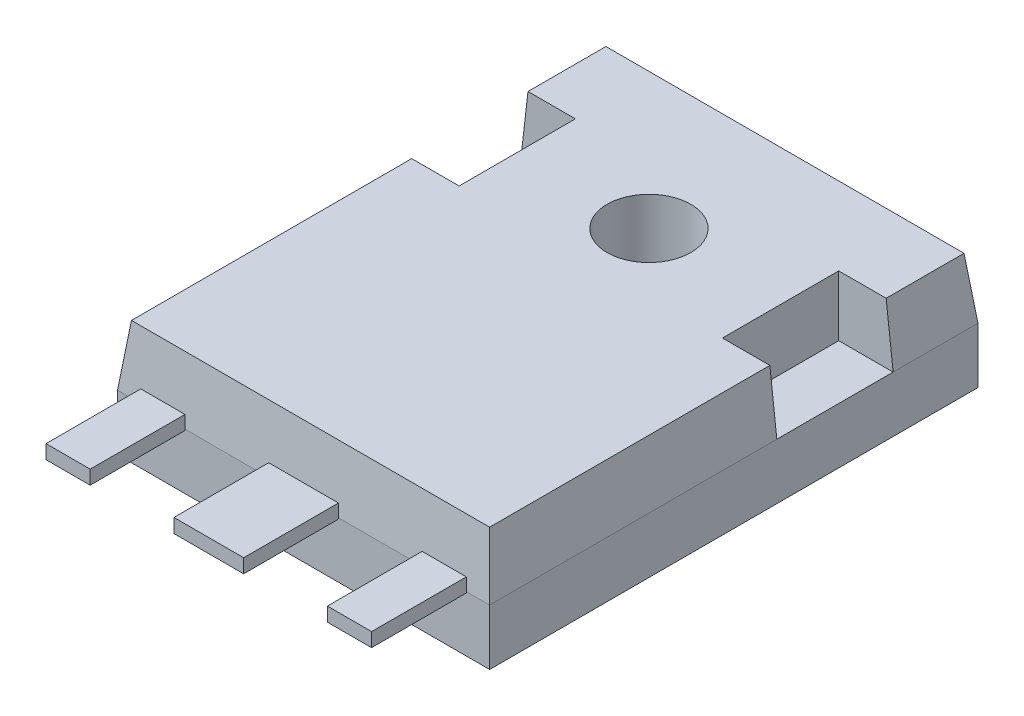
ISO-10303-21;
HEADER;
FILE_DESCRIPTION(('STEP AP214'),'2;1');
FILE_NAME('part.step','',(''),(''),'','','');
FILE_SCHEMA(('AUTOMOTIVE_DESIGN { 1 0 10303 214 1 1 1 1 }'));
ENDSEC;
DATA;
#1=APPLICATION_CONTEXT('core data for automotive mechanical design processes');
#2=APPLICATION_PROTOCOL_DEFINITION('international standard','automotive_design',2000,#1);
#3=PRODUCT_CONTEXT('',#1,'mechanical');
#4=PRODUCT('Part','Part','',(#3));
#5=PRODUCT_RELATED_PRODUCT_CATEGORY('part','',(#4));
#6=PRODUCT_DEFINITION_FORMATION('','',#4);
#7=PRODUCT_DEFINITION_CONTEXT('part definition',#1,'design');
#8=PRODUCT_DEFINITION('design','',#6,#7);
#9=PRODUCT_DEFINITION_SHAPE('','',#8);
#10=(LENGTH_UNIT() NAMED_UNIT(*) SI_UNIT(.MILLI.,.METRE.));
#11=(NAMED_UNIT(*) PLANE_ANGLE_UNIT() SI_UNIT($,.RADIAN.));
#12=(NAMED_UNIT(*) SI_UNIT($,.STERADIAN.) SOLID_ANGLE_UNIT());
#13=UNCERTAINTY_MEASURE_WITH_UNIT(LENGTH_MEASURE(1.E-05),#10,'distance_accuracy_value','');
#14=(GEOMETRIC_REPRESENTATION_CONTEXT(3) GLOBAL_UNCERTAINTY_ASSIGNED_CONTEXT((#13)) GLOBAL_UNIT_ASSIGNED_CONTEXT((#10,
#11,#12)) REPRESENTATION_CONTEXT('',''));
#15=CARTESIAN_POINT('',(0.,0.,0.));
#16=DIRECTION('',(0.,0.,1.));
#17=DIRECTION('',(1.,0.,0.));
#18=AXIS2_PLACEMENT_3D('',#15,#16,#17);
#19=CARTESIAN_POINT('',(-8.00000000000001,5.,10.5));
#20=DIRECTION('',(0.,0.,-1.));
#21=DIRECTION('',(-1.,0.,0.));
#22=AXIS2_PLACEMENT_3D('',#19,#20,#21);
#23=PLANE('',#22);
#24=DIRECTION('',(0.,1.,0.));
#25=VECTOR('',#24,1.);
#26=CARTESIAN_POINT('',(1.5,2.35,10.5));
#27=LINE('',#26,#25);
#28=CARTESIAN_POINT('',(1.5,2.35,10.5));
#29=VERTEX_POINT('',#28);
#30=CARTESIAN_POINT('',(1.5,2.39999999999993,10.5));
#31=VERTEX_POINT('',#30);
#32=EDGE_CURVE('E926',#29,#31,#27,.T.);
#33=ORIENTED_EDGE('',*,*,#32,.F.);
#34=DIRECTION('',(1.,0.,0.));
#35=VECTOR('',#34,1.);
#36=CARTESIAN_POINT('',(-1.5,2.35,10.5));
#37=LINE('',#36,#35);
#38=CARTESIAN_POINT('',(-1.5,2.35,10.5));
#39=VERTEX_POINT('',#38);
#40=EDGE_CURVE('E890',#39,#29,#37,.T.);
#41=ORIENTED_EDGE('',*,*,#40,.F.);
#42=DIRECTION('',(0.,-1.,0.));
#43=VECTOR('',#42,1.);
#44=CARTESIAN_POINT('',(-1.5,2.35,10.5));
#45=LINE('',#44,#43);
#46=CARTESIAN_POINT('',(-1.5,2.39999999999993,10.5));
#47=VERTEX_POINT('',#46);
#48=EDGE_CURVE('E885',#47,#39,#45,.T.);
#49=ORIENTED_EDGE('',*,*,#48,.F.);
#50=DIRECTION('',(-1.,0.,0.));
#51=VECTOR('',#50,1.);
#52=CARTESIAN_POINT('',(-8.00000000000001,2.39999999999993,10.5));
#53=LINE('',#52,#51);
#54=CARTESIAN_POINT('',(-5.10000000000001,2.39999999999993,10.5));
#55=VERTEX_POINT('',#54);
#56=EDGE_CURVE('E384',#47,#55,#53,.T.);
#57=ORIENTED_EDGE('',*,*,#56,.T.);
#58=DIRECTION('',(0.,1.,0.));
#59=VECTOR('',#58,1.);
#60=CARTESIAN_POINT('',(-5.10000000000001,2.35,10.5));
#61=LINE('',#60,#59);
#62=CARTESIAN_POINT('',(-5.10000000000001,2.35,10.5));
#63=VERTEX_POINT('',#62);
#64=EDGE_CURVE('E266',#63,#55,#61,.T.);
#65=ORIENTED_EDGE('',*,*,#64,.F.);
#66=DIRECTION('',(1.,0.,0.));
#67=VECTOR('',#66,1.);
#68=CARTESIAN_POINT('',(-7.00000000000001,2.35,10.5));
#69=LINE('',#68,#67);
#70=CARTESIAN_POINT('',(-7.00000000000001,2.35,10.5));
#71=VERTEX_POINT('',#70);
#72=EDGE_CURVE('E262',#71,#63,#69,.T.);
#73=ORIENTED_EDGE('',*,*,#72,.F.);
#74=DIRECTION('',(0.,-1.,0.));
#75=VECTOR('',#74,1.);
#76=CARTESIAN_POINT('',(-7.00000000000001,2.35,10.5));
#77=LINE('',#76,#75);
#78=CARTESIAN_POINT('',(-7.00000000000001,2.39999999999993,10.5));
#79=VERTEX_POINT('',#78);
#80=EDGE_CURVE('E47',#79,#71,#77,.T.);
#81=ORIENTED_EDGE('',*,*,#80,.F.);
#82=CARTESIAN_POINT('',(-8.00000000000001,2.39999999999993,10.5));
#83=VERTEX_POINT('',#82);
#84=EDGE_CURVE('E378',#79,#83,#53,.T.);
#85=ORIENTED_EDGE('',*,*,#84,.T.);
#86=DIRECTION('',(0.,-1.,0.));
#87=VECTOR('',#86,1.);
#88=CARTESIAN_POINT('',(-8.00000000000001,5.,10.5));
#89=LINE('',#88,#87);
#90=CARTESIAN_POINT('',(-8.00000000000001,0.,10.5));
#91=VERTEX_POINT('',#90);
#92=EDGE_CURVE('E352',#83,#91,#89,.T.);
#93=ORIENTED_EDGE('',*,*,#92,.T.);
#94=DIRECTION('',(1.,0.,0.));
#95=VECTOR('',#94,1.);
#96=CARTESIAN_POINT('',(-8.00000000000001,0.,10.5));
#97=LINE('',#96,#95);
#98=CARTESIAN_POINT('',(7.99999999999999,0.,10.5));
#99=VERTEX_POINT('',#98);
#100=EDGE_CURVE('E347',#91,#99,#97,.T.);
#101=ORIENTED_EDGE('',*,*,#100,.T.);
#102=DIRECTION('',(0.,-1.,0.));
#103=VECTOR('',#102,1.);
#104=CARTESIAN_POINT('',(7.99999999999999,5.,10.5));
#105=LINE('',#104,#103);
#106=CARTESIAN_POINT('',(7.99999999999999,2.39999999999993,10.5));
#107=VERTEX_POINT('',#106);
#108=EDGE_CURVE('E350',#107,#99,#105,.T.);
#109=ORIENTED_EDGE('',*,*,#108,.F.);
#110=CARTESIAN_POINT('',(7.,2.39999999999993,10.5));
#111=VERTEX_POINT('',#110);
#112=EDGE_CURVE('E379',#107,#111,#53,.T.);
#113=ORIENTED_EDGE('',*,*,#112,.T.);
#114=DIRECTION('',(0.,1.,0.));
#115=VECTOR('',#114,1.);
#116=CARTESIAN_POINT('',(7.00000000000001,2.35,10.5));
#117=LINE('',#116,#115);
#118=CARTESIAN_POINT('',(7.00000000000001,2.35,10.5));
#119=VERTEX_POINT('',#118);
#120=EDGE_CURVE('E908',#119,#111,#117,.T.);
#121=ORIENTED_EDGE('',*,*,#120,.F.);
#122=DIRECTION('',(1.,0.,0.));
#123=VECTOR('',#122,1.);
#124=CARTESIAN_POINT('',(7.00000000000001,2.35,10.5));
#125=LINE('',#124,#123);
#126=CARTESIAN_POINT('',(5.10000000000001,2.35,10.5));
#127=VERTEX_POINT('',#126);
#128=EDGE_CURVE('E905',#127,#119,#125,.T.);
#129=ORIENTED_EDGE('',*,*,#128,.F.);
#130=DIRECTION('',(0.,-1.,0.));
#131=VECTOR('',#130,1.);
#132=CARTESIAN_POINT('',(5.10000000000001,2.35,10.5));
#133=LINE('',#132,#131);
#134=CARTESIAN_POINT('',(5.10000000000001,2.39999999999993,10.5));
#135=VERTEX_POINT('',#134);
#136=EDGE_CURVE('E912',#135,#127,#133,.T.);
#137=ORIENTED_EDGE('',*,*,#136,.F.);
#138=EDGE_CURVE('E868',#135,#31,#53,.T.);
#139=ORIENTED_EDGE('',*,*,#138,.T.);
#140=EDGE_LOOP('',(#33,#41,#49,#57,#65,#73,#81,#85,#93,#101,#109,#113,#121,#129,#137,#139));
#141=FACE_BOUND('',#140,.T.);
#142=ADVANCED_FACE('F39',(#141),#23,.F.);
#143=CARTESIAN_POINT('',(7.99999999999999,5.,10.5));
#144=DIRECTION('',(-1.,0.,0.));
#145=DIRECTION('',(0.,0.,1.));
#146=AXIS2_PLACEMENT_3D('',#143,#144,#145);
#147=PLANE('',#146);
#148=DIRECTION('',(0.,0.,-1.));
#149=VECTOR('',#148,1.);
#150=CARTESIAN_POINT('',(8.00000000000001,2.4,-6.84999999999999));
#151=LINE('',#150,#149);
#152=CARTESIAN_POINT('',(8.00000000000001,2.4,-1.84999999999999));
#153=VERTEX_POINT('',#152);
#154=CARTESIAN_POINT('',(8.00000000000001,2.4,-6.84999999999999));
#155=VERTEX_POINT('',#154);
#156=EDGE_CURVE('E299',#153,#155,#151,.T.);
#157=ORIENTED_EDGE('',*,*,#156,.F.);
#158=DIRECTION('',(0.,0.,1.));
#159=VECTOR('',#158,1.);
#160=CARTESIAN_POINT('',(7.99999999999999,2.39999999999993,10.5));
#161=LINE('',#160,#159);
#162=EDGE_CURVE('E376',#153,#107,#161,.T.);
#163=ORIENTED_EDGE('',*,*,#162,.T.);
#164=ORIENTED_EDGE('',*,*,#108,.T.);
#165=DIRECTION('',(0.,0.,-1.));
#166=VECTOR('',#165,1.);
#167=CARTESIAN_POINT('',(7.99999999999999,0.,10.5));
#168=LINE('',#167,#166);
#169=CARTESIAN_POINT('',(7.99999999999999,0.,-10.5));
#170=VERTEX_POINT('',#169);
#171=EDGE_CURVE('E336',#99,#170,#168,.T.);
#172=ORIENTED_EDGE('',*,*,#171,.T.);
#173=DIRECTION('',(0.,-1.,0.));
#174=VECTOR('',#173,1.);
#175=CARTESIAN_POINT('',(7.99999999999999,5.,-10.5));
#176=LINE('',#175,#174);
#177=CARTESIAN_POINT('',(7.99999999999999,2.39999999999993,-10.5));
#178=VERTEX_POINT('',#177);
#179=EDGE_CURVE('E356',#178,#170,#176,.T.);
#180=ORIENTED_EDGE('',*,*,#179,.F.);
#181=DIRECTION('',(0.,0.,1.));
#182=VECTOR('',#181,1.);
#183=CARTESIAN_POINT('',(7.99999999999999,2.39999999999993,10.5));
#184=LINE('',#183,#182);
#185=EDGE_CURVE('E374',#178,#155,#184,.T.);
#186=ORIENTED_EDGE('',*,*,#185,.T.);
#187=EDGE_LOOP('',(#157,#163,#164,#172,#180,#186));
#188=FACE_BOUND('',#187,.T.);
#189=ADVANCED_FACE('F459',(#188),#147,.F.);
#190=CARTESIAN_POINT('',(-8.00000000000001,5.,-10.5));
#191=DIRECTION('',(0.,0.,1.));
#192=DIRECTION('',(1.,0.,0.));
#193=AXIS2_PLACEMENT_3D('',#190,#191,#192);
#194=PLANE('',#193);
#195=DIRECTION('',(0.,-1.,0.));
#196=VECTOR('',#195,1.);
#197=CARTESIAN_POINT('',(-8.00000000000001,5.,-10.5));
#198=LINE('',#197,#196);
#199=CARTESIAN_POINT('',(-8.00000000000001,2.39999999999993,-10.5));
#200=VERTEX_POINT('',#199);
#201=CARTESIAN_POINT('',(-8.00000000000001,0.,-10.5));
#202=VERTEX_POINT('',#201);
#203=EDGE_CURVE('E354',#200,#202,#198,.T.);
#204=ORIENTED_EDGE('',*,*,#203,.F.);
#205=DIRECTION('',(1.,0.,0.));
#206=VECTOR('',#205,1.);
#207=CARTESIAN_POINT('',(-8.00000000000001,2.39999999999993,-10.5));
#208=LINE('',#207,#206);
#209=EDGE_CURVE('E393',#200,#178,#208,.T.);
#210=ORIENTED_EDGE('',*,*,#209,.T.);
#211=ORIENTED_EDGE('',*,*,#179,.T.);
#212=DIRECTION('',(-1.,0.,0.));
#213=VECTOR('',#212,1.);
#214=CARTESIAN_POINT('',(-8.00000000000001,0.,-10.5));
#215=LINE('',#214,#213);
#216=EDGE_CURVE('E341',#170,#202,#215,.T.);
#217=ORIENTED_EDGE('',*,*,#216,.T.);
#218=EDGE_LOOP('',(#204,#210,#211,#217));
#219=FACE_BOUND('',#218,.T.);
#220=ADVANCED_FACE('F481',(#219),#194,.F.);
#221=CARTESIAN_POINT('',(-8.00000000000001,5.,10.5));
#222=DIRECTION('',(1.,0.,0.));
#223=DIRECTION('',(0.,0.,-1.));
#224=AXIS2_PLACEMENT_3D('',#221,#222,#223);
#225=PLANE('',#224);
#226=ORIENTED_EDGE('',*,*,#92,.F.);
#227=DIRECTION('',(0.,0.,-1.));
#228=VECTOR('',#227,1.);
#229=CARTESIAN_POINT('',(-8.00000000000001,2.39999999999993,10.5));
#230=LINE('',#229,#228);
#231=CARTESIAN_POINT('',(-8.00000000000001,2.4,-1.84999999999999));
#232=VERTEX_POINT('',#231);
#233=EDGE_CURVE('E387',#83,#232,#230,.T.);
#234=ORIENTED_EDGE('',*,*,#233,.T.);
#235=DIRECTION('',(0.,0.,1.));
#236=VECTOR('',#235,1.);
#237=CARTESIAN_POINT('',(-8.00000000000001,2.4,-6.84999999999999));
#238=LINE('',#237,#236);
#239=CARTESIAN_POINT('',(-8.00000000000001,2.4,-6.84999999999999));
#240=VERTEX_POINT('',#239);
#241=EDGE_CURVE('E314',#240,#232,#238,.T.);
#242=ORIENTED_EDGE('',*,*,#241,.F.);
#243=DIRECTION('',(0.,0.,-1.));
#244=VECTOR('',#243,1.);
#245=CARTESIAN_POINT('',(-8.00000000000001,2.39999999999993,10.5));
#246=LINE('',#245,#244);
#247=EDGE_CURVE('E382',#240,#200,#246,.T.);
#248=ORIENTED_EDGE('',*,*,#247,.T.);
#249=ORIENTED_EDGE('',*,*,#203,.T.);
#250=DIRECTION('',(0.,0.,1.));
#251=VECTOR('',#250,1.);
#252=CARTESIAN_POINT('',(-8.00000000000001,0.,10.5));
#253=LINE('',#252,#251);
#254=EDGE_CURVE('E344',#202,#91,#253,.T.);
#255=ORIENTED_EDGE('',*,*,#254,.T.);
#256=EDGE_LOOP('',(#226,#234,#242,#248,#249,#255));
#257=FACE_BOUND('',#256,.T.);
#258=ADVANCED_FACE('F488',(#257),#225,.F.);
#259=CARTESIAN_POINT('',(0.,5.,0.));
#260=DIRECTION('',(0.,-1.,0.));
#261=DIRECTION('',(0.,0.,-1.));
#262=AXIS2_PLACEMENT_3D('',#259,#260,#261);
#263=PLANE('',#262);
#264=CARTESIAN_POINT('',(0.,5.,-4.34999999999999));
#265=DIRECTION('',(0.,1.,0.));
#266=DIRECTION('',(0.,0.,1.));
#267=AXIS2_PLACEMENT_3D('',#264,#265,#266);
#268=CIRCLE('',#267,1.8);
#269=CARTESIAN_POINT('',(0.,5.,-2.54999999999999));
#270=VERTEX_POINT('',#269);
#271=EDGE_CURVE('E285',#270,#270,#268,.T.);
#272=ORIENTED_EDGE('',*,*,#271,.F.);
#273=EDGE_LOOP('',(#272));
#274=FACE_BOUND('',#273,.T.);
#275=DIRECTION('',(1.,0.,0.));
#276=VECTOR('',#275,1.);
#277=CARTESIAN_POINT('',(0.,5.,10.2));
#278=LINE('',#277,#276);
#279=CARTESIAN_POINT('',(-7.70000000000001,5.,10.2));
#280=VERTEX_POINT('',#279);
#281=CARTESIAN_POINT('',(7.69999999999999,5.,10.2));
#282=VERTEX_POINT('',#281);
#283=EDGE_CURVE('E367',#280,#282,#278,.T.);
#284=ORIENTED_EDGE('',*,*,#283,.T.);
#285=DIRECTION('',(0.,0.,-1.));
#286=VECTOR('',#285,1.);
#287=CARTESIAN_POINT('',(7.69999999999999,5.,0.));
#288=LINE('',#287,#286);
#289=CARTESIAN_POINT('',(7.69999999999999,5.,-1.84999999999999));
#290=VERTEX_POINT('',#289);
#291=EDGE_CURVE('E369',#282,#290,#288,.T.);
#292=ORIENTED_EDGE('',*,*,#291,.T.);
#293=DIRECTION('',(1.,0.,0.));
#294=VECTOR('',#293,1.);
#295=CARTESIAN_POINT('',(8.00000000000001,5.,-1.84999999999999));
#296=LINE('',#295,#294);
#297=CARTESIAN_POINT('',(5.66176470588236,5.,-1.84999999999999));
#298=VERTEX_POINT('',#297);
#299=EDGE_CURVE('E293',#298,#290,#296,.T.);
#300=ORIENTED_EDGE('',*,*,#299,.F.);
#301=DIRECTION('',(0.,0.,1.));
#302=VECTOR('',#301,1.);
#303=CARTESIAN_POINT('',(5.66176470588236,5.,-6.84999999999999));
#304=LINE('',#303,#302);
#305=CARTESIAN_POINT('',(5.66176470588236,5.,-6.84999999999999));
#306=VERTEX_POINT('',#305);
#307=EDGE_CURVE('E304',#306,#298,#304,.T.);
#308=ORIENTED_EDGE('',*,*,#307,.F.);
#309=DIRECTION('',(-1.,0.,0.));
#310=VECTOR('',#309,1.);
#311=CARTESIAN_POINT('',(8.00000000000001,5.,-6.84999999999999));
#312=LINE('',#311,#310);
#313=CARTESIAN_POINT('',(7.69999999999999,5.,-6.84999999999999));
#314=VERTEX_POINT('',#313);
#315=EDGE_CURVE('E284',#314,#306,#312,.T.);
#316=ORIENTED_EDGE('',*,*,#315,.F.);
#317=DIRECTION('',(0.,0.,-1.));
#318=VECTOR('',#317,1.);
#319=CARTESIAN_POINT('',(7.69999999999999,5.,0.));
#320=LINE('',#319,#318);
#321=CARTESIAN_POINT('',(7.69999999999999,5.,-10.2));
#322=VERTEX_POINT('',#321);
#323=EDGE_CURVE('E362',#314,#322,#320,.T.);
#324=ORIENTED_EDGE('',*,*,#323,.T.);
#325=DIRECTION('',(-1.,0.,0.));
#326=VECTOR('',#325,1.);
#327=CARTESIAN_POINT('',(0.,5.,-10.2));
#328=LINE('',#327,#326);
#329=CARTESIAN_POINT('',(-7.70000000000001,5.,-10.2));
#330=VERTEX_POINT('',#329);
#331=EDGE_CURVE('E360',#322,#330,#328,.T.);
#332=ORIENTED_EDGE('',*,*,#331,.T.);
#333=DIRECTION('',(0.,0.,1.));
#334=VECTOR('',#333,1.);
#335=CARTESIAN_POINT('',(-7.70000000000001,5.,0.));
#336=LINE('',#335,#334);
#337=CARTESIAN_POINT('',(-7.70000000000001,5.,-6.84999999999999));
#338=VERTEX_POINT('',#337);
#339=EDGE_CURVE('E358',#330,#338,#336,.T.);
#340=ORIENTED_EDGE('',*,*,#339,.T.);
#341=DIRECTION('',(-1.,0.,0.));
#342=VECTOR('',#341,1.);
#343=CARTESIAN_POINT('',(-8.00000000000001,5.,-6.84999999999999));
#344=LINE('',#343,#342);
#345=CARTESIAN_POINT('',(-5.66176470588236,5.,-6.84999999999999));
#346=VERTEX_POINT('',#345);
#347=EDGE_CURVE('E318',#346,#338,#344,.T.);
#348=ORIENTED_EDGE('',*,*,#347,.F.);
#349=DIRECTION('',(0.,0.,-1.));
#350=VECTOR('',#349,1.);
#351=CARTESIAN_POINT('',(-5.66176470588236,5.,-6.84999999999999));
#352=LINE('',#351,#350);
#353=CARTESIAN_POINT('',(-5.66176470588236,5.,-1.84999999999999));
#354=VERTEX_POINT('',#353);
#355=EDGE_CURVE('E329',#354,#346,#352,.T.);
#356=ORIENTED_EDGE('',*,*,#355,.F.);
#357=DIRECTION('',(1.,0.,0.));
#358=VECTOR('',#357,1.);
#359=CARTESIAN_POINT('',(-8.00000000000001,5.,-1.84999999999999));
#360=LINE('',#359,#358);
#361=CARTESIAN_POINT('',(-7.70000000000001,5.,-1.84999999999999));
#362=VERTEX_POINT('',#361);
#363=EDGE_CURVE('E311',#362,#354,#360,.T.);
#364=ORIENTED_EDGE('',*,*,#363,.F.);
#365=DIRECTION('',(0.,0.,1.));
#366=VECTOR('',#365,1.);
#367=CARTESIAN_POINT('',(-7.70000000000001,5.,0.));
#368=LINE('',#367,#366);
#369=EDGE_CURVE('E365',#362,#280,#368,.T.);
#370=ORIENTED_EDGE('',*,*,#369,.T.);
#371=EDGE_LOOP('',(#284,#292,#300,#308,#316,#324,#332,#340,#348,#356,#364,#370));
#372=FACE_BOUND('',#371,.T.);
#373=ADVANCED_FACE('F416',(#274,#372),#263,.F.);
#374=CARTESIAN_POINT('',(0.,0.,0.));
#375=DIRECTION('',(0.,-1.,0.));
#376=DIRECTION('',(0.,0.,-1.));
#377=AXIS2_PLACEMENT_3D('',#374,#375,#376);
#378=PLANE('',#377);
#379=CARTESIAN_POINT('',(0.,0.,-4.34999999999999));
#380=DIRECTION('',(0.,1.,0.));
#381=DIRECTION('',(0.,0.,1.));
#382=AXIS2_PLACEMENT_3D('',#379,#380,#381);
#383=CIRCLE('',#382,1.8);
#384=CARTESIAN_POINT('',(0.,0.,-2.54999999999999));
#385=VERTEX_POINT('',#384);
#386=EDGE_CURVE('E281',#385,#385,#383,.T.);
#387=ORIENTED_EDGE('',*,*,#386,.T.);
#388=EDGE_LOOP('',(#387));
#389=FACE_BOUND('',#388,.T.);
#390=ORIENTED_EDGE('',*,*,#171,.F.);
#391=ORIENTED_EDGE('',*,*,#100,.F.);
#392=ORIENTED_EDGE('',*,*,#254,.F.);
#393=ORIENTED_EDGE('',*,*,#216,.F.);
#394=EDGE_LOOP('',(#390,#391,#392,#393));
#395=FACE_BOUND('',#394,.T.);
#396=ADVANCED_FACE('F486',(#389,#395),#378,.T.);
#397=CARTESIAN_POINT('',(-8.00000000000001,2.4,-6.84999999999999));
#398=DIRECTION('',(0.,0.,-1.));
#399=DIRECTION('',(-1.,0.,0.));
#400=AXIS2_PLACEMENT_3D('',#397,#398,#399);
#401=PLANE('',#400);
#402=ORIENTED_EDGE('',*,*,#347,.T.);
#403=DIRECTION('',(0.114624107985127,0.993408935871132,0.));
#404=VECTOR('',#403,1.);
#405=CARTESIAN_POINT('',(-7.70000000000001,5.,-6.84999999999999));
#406=LINE('',#405,#404);
#407=EDGE_CURVE('E395',#338,#240,#406,.F.);
#408=ORIENTED_EDGE('',*,*,#407,.T.);
#409=DIRECTION('',(-1.,0.,0.));
#410=VECTOR('',#409,1.);
#411=CARTESIAN_POINT('',(-8.00000000000001,2.4,-6.84999999999999));
#412=LINE('',#411,#410);
#413=CARTESIAN_POINT('',(-5.66176470588236,2.4,-6.84999999999999));
#414=VERTEX_POINT('',#413);
#415=EDGE_CURVE('E324',#414,#240,#412,.T.);
#416=ORIENTED_EDGE('',*,*,#415,.F.);
#417=DIRECTION('',(0.,1.,0.));
#418=VECTOR('',#417,1.);
#419=CARTESIAN_POINT('',(-5.66176470588236,2.4,-6.84999999999999));
#420=LINE('',#419,#418);
#421=EDGE_CURVE('E334',#414,#346,#420,.T.);
#422=ORIENTED_EDGE('',*,*,#421,.T.);
#423=EDGE_LOOP('',(#402,#408,#416,#422));
#424=FACE_BOUND('',#423,.T.);
#425=ADVANCED_FACE('F419',(#424),#401,.F.);
#426=CARTESIAN_POINT('',(-5.66176470588236,2.4,-6.84999999999999));
#427=DIRECTION('',(1.,0.,0.));
#428=DIRECTION('',(0.,0.,-1.));
#429=AXIS2_PLACEMENT_3D('',#426,#427,#428);
#430=PLANE('',#429);
#431=ORIENTED_EDGE('',*,*,#355,.T.);
#432=ORIENTED_EDGE('',*,*,#421,.F.);
#433=DIRECTION('',(0.,0.,-1.));
#434=VECTOR('',#433,1.);
#435=CARTESIAN_POINT('',(-5.66176470588236,2.4,-6.84999999999999));
#436=LINE('',#435,#434);
#437=CARTESIAN_POINT('',(-5.66176470588236,2.4,-1.84999999999999));
#438=VERTEX_POINT('',#437);
#439=EDGE_CURVE('E321',#438,#414,#436,.T.);
#440=ORIENTED_EDGE('',*,*,#439,.F.);
#441=DIRECTION('',(0.,1.,0.));
#442=VECTOR('',#441,1.);
#443=CARTESIAN_POINT('',(-5.66176470588236,2.4,-1.84999999999999));
#444=LINE('',#443,#442);
#445=EDGE_CURVE('E327',#438,#354,#444,.T.);
#446=ORIENTED_EDGE('',*,*,#445,.T.);
#447=EDGE_LOOP('',(#431,#432,#440,#446));
#448=FACE_BOUND('',#447,.T.);
#449=ADVANCED_FACE('F423',(#448),#430,.F.);
#450=CARTESIAN_POINT('',(-8.00000000000001,2.4,-1.84999999999999));
#451=DIRECTION('',(0.,0.,1.));
#452=DIRECTION('',(1.,0.,0.));
#453=AXIS2_PLACEMENT_3D('',#450,#451,#452);
#454=PLANE('',#453);
#455=DIRECTION('',(1.,0.,0.));
#456=VECTOR('',#455,1.);
#457=CARTESIAN_POINT('',(-8.00000000000001,2.4,-1.84999999999999));
#458=LINE('',#457,#456);
#459=EDGE_CURVE('E317',#232,#438,#458,.T.);
#460=ORIENTED_EDGE('',*,*,#459,.F.);
#461=DIRECTION('',(-0.114624107985127,-0.993408935871132,0.));
#462=VECTOR('',#461,1.);
#463=CARTESIAN_POINT('',(-7.70000000000001,5.,-1.84999999999999));
#464=LINE('',#463,#462);
#465=EDGE_CURVE('E389',#232,#362,#464,.F.);
#466=ORIENTED_EDGE('',*,*,#465,.T.);
#467=ORIENTED_EDGE('',*,*,#363,.T.);
#468=ORIENTED_EDGE('',*,*,#445,.F.);
#469=EDGE_LOOP('',(#460,#466,#467,#468));
#470=FACE_BOUND('',#469,.T.);
#471=ADVANCED_FACE('F597',(#470),#454,.F.);
#472=CARTESIAN_POINT('',(0.,2.4,0.));
#473=DIRECTION('',(0.,1.,0.));
#474=DIRECTION('',(0.,0.,1.));
#475=AXIS2_PLACEMENT_3D('',#472,#473,#474);
#476=PLANE('',#475);
#477=ORIENTED_EDGE('',*,*,#241,.T.);
#478=ORIENTED_EDGE('',*,*,#459,.T.);
#479=ORIENTED_EDGE('',*,*,#439,.T.);
#480=ORIENTED_EDGE('',*,*,#415,.T.);
#481=EDGE_LOOP('',(#477,#478,#479,#480));
#482=FACE_BOUND('',#481,.T.);
#483=ADVANCED_FACE('F587',(#482),#476,.T.);
#484=CARTESIAN_POINT('',(8.00000000000001,2.4,-6.84999999999999));
#485=DIRECTION('',(0.,0.,-1.));
#486=DIRECTION('',(-1.,0.,0.));
#487=AXIS2_PLACEMENT_3D('',#484,#485,#486);
#488=PLANE('',#487);
#489=DIRECTION('',(-1.,0.,0.));
#490=VECTOR('',#489,1.);
#491=CARTESIAN_POINT('',(8.00000000000001,2.4,-6.84999999999999));
#492=LINE('',#491,#490);
#493=CARTESIAN_POINT('',(5.66176470588236,2.4,-6.84999999999999));
#494=VERTEX_POINT('',#493);
#495=EDGE_CURVE('E289',#155,#494,#492,.T.);
#496=ORIENTED_EDGE('',*,*,#495,.F.);
#497=DIRECTION('',(0.114624107985127,-0.993408935871132,0.));
#498=VECTOR('',#497,1.);
#499=CARTESIAN_POINT('',(7.69999999999999,5.,-6.84999999999999));
#500=LINE('',#499,#498);
#501=EDGE_CURVE('E391',#155,#314,#500,.F.);
#502=ORIENTED_EDGE('',*,*,#501,.T.);
#503=ORIENTED_EDGE('',*,*,#315,.T.);
#504=DIRECTION('',(0.,1.,0.));
#505=VECTOR('',#504,1.);
#506=CARTESIAN_POINT('',(5.66176470588236,2.4,-6.84999999999999));
#507=LINE('',#506,#505);
#508=EDGE_CURVE('E302',#494,#306,#507,.T.);
#509=ORIENTED_EDGE('',*,*,#508,.F.);
#510=EDGE_LOOP('',(#496,#502,#503,#509));
#511=FACE_BOUND('',#510,.T.);
#512=ADVANCED_FACE('F461',(#511),#488,.F.);
#513=CARTESIAN_POINT('',(8.00000000000001,2.4,-1.84999999999999));
#514=DIRECTION('',(0.,0.,1.));
#515=DIRECTION('',(1.,0.,0.));
#516=AXIS2_PLACEMENT_3D('',#513,#514,#515);
#517=PLANE('',#516);
#518=ORIENTED_EDGE('',*,*,#299,.T.);
#519=DIRECTION('',(-0.114624107985127,0.993408935871132,0.));
#520=VECTOR('',#519,1.);
#521=CARTESIAN_POINT('',(7.69999999999999,5.,-1.84999999999999));
#522=LINE('',#521,#520);
#523=EDGE_CURVE('E372',#290,#153,#522,.F.);
#524=ORIENTED_EDGE('',*,*,#523,.T.);
#525=DIRECTION('',(1.,0.,0.));
#526=VECTOR('',#525,1.);
#527=CARTESIAN_POINT('',(8.00000000000001,2.4,-1.84999999999999));
#528=LINE('',#527,#526);
#529=CARTESIAN_POINT('',(5.66176470588236,2.4,-1.84999999999999));
#530=VERTEX_POINT('',#529);
#531=EDGE_CURVE('E296',#530,#153,#528,.T.);
#532=ORIENTED_EDGE('',*,*,#531,.F.);
#533=DIRECTION('',(0.,1.,0.));
#534=VECTOR('',#533,1.);
#535=CARTESIAN_POINT('',(5.66176470588236,2.4,-1.84999999999999));
#536=LINE('',#535,#534);
#537=EDGE_CURVE('E309',#530,#298,#536,.T.);
#538=ORIENTED_EDGE('',*,*,#537,.T.);
#539=EDGE_LOOP('',(#518,#524,#532,#538));
#540=FACE_BOUND('',#539,.T.);
#541=ADVANCED_FACE('F443',(#540),#517,.F.);
#542=CARTESIAN_POINT('',(5.66176470588236,2.4,-6.84999999999999));
#543=DIRECTION('',(-1.,0.,0.));
#544=DIRECTION('',(0.,0.,1.));
#545=AXIS2_PLACEMENT_3D('',#542,#543,#544);
#546=PLANE('',#545);
#547=ORIENTED_EDGE('',*,*,#307,.T.);
#548=ORIENTED_EDGE('',*,*,#537,.F.);
#549=DIRECTION('',(0.,0.,1.));
#550=VECTOR('',#549,1.);
#551=CARTESIAN_POINT('',(5.66176470588236,2.4,-6.84999999999999));
#552=LINE('',#551,#550);
#553=EDGE_CURVE('E292',#494,#530,#552,.T.);
#554=ORIENTED_EDGE('',*,*,#553,.F.);
#555=ORIENTED_EDGE('',*,*,#508,.T.);
#556=EDGE_LOOP('',(#547,#548,#554,#555));
#557=FACE_BOUND('',#556,.T.);
#558=ADVANCED_FACE('F447',(#557),#546,.F.);
#559=CARTESIAN_POINT('',(0.,2.4,0.));
#560=DIRECTION('',(0.,1.,0.));
#561=DIRECTION('',(0.,0.,1.));
#562=AXIS2_PLACEMENT_3D('',#559,#560,#561);
#563=PLANE('',#562);
#564=ORIENTED_EDGE('',*,*,#495,.T.);
#565=ORIENTED_EDGE('',*,*,#553,.T.);
#566=ORIENTED_EDGE('',*,*,#531,.T.);
#567=ORIENTED_EDGE('',*,*,#156,.T.);
#568=EDGE_LOOP('',(#564,#565,#566,#567));
#569=FACE_BOUND('',#568,.T.);
#570=ADVANCED_FACE('F463',(#569),#563,.T.);
#571=CARTESIAN_POINT('',(0.,0.,-4.34999999999999));
#572=DIRECTION('',(0.,1.,0.));
#573=DIRECTION('',(0.,0.,1.));
#574=AXIS2_PLACEMENT_3D('',#571,#572,#573);
#575=CYLINDRICAL_SURFACE('',#574,1.8);
#576=ORIENTED_EDGE('',*,*,#386,.F.);
#577=EDGE_LOOP('',(#576));
#578=FACE_BOUND('',#577,.T.);
#579=ORIENTED_EDGE('',*,*,#271,.T.);
#580=EDGE_LOOP('',(#579));
#581=FACE_BOUND('',#580,.T.);
#582=ADVANCED_FACE('F465',(#578,#581),#575,.F.);
#583=CARTESIAN_POINT('',(-7.70000000000001,5.,0.));
#584=DIRECTION('',(0.993408935871131,-0.114624107985127,0.));
#585=DIRECTION('',(0.,0.,1.));
#586=AXIS2_PLACEMENT_3D('',#583,#584,#585);
#587=PLANE('',#586);
#588=ORIENTED_EDGE('',*,*,#465,.F.);
#589=ORIENTED_EDGE('',*,*,#233,.F.);
#590=DIRECTION('',(0.113878442700165,0.986946503401461,-0.113878442700165));
#591=VECTOR('',#590,1.);
#592=CARTESIAN_POINT('',(-7.56772334293949,6.14639769452447,10.0677233429395));
#593=LINE('',#592,#591);
#594=EDGE_CURVE('E288',#280,#83,#593,.F.);
#595=ORIENTED_EDGE('',*,*,#594,.F.);
#596=ORIENTED_EDGE('',*,*,#369,.F.);
#597=EDGE_LOOP('',(#588,#589,#595,#596));
#598=FACE_BOUND('',#597,.T.);
#599=ADVANCED_FACE('F430',(#598),#587,.F.);
#600=CARTESIAN_POINT('',(0.,5.,10.2));
#601=DIRECTION('',(0.,-0.114624107985127,-0.993408935871131));
#602=DIRECTION('',(1.,0.,0.));
#603=AXIS2_PLACEMENT_3D('',#600,#601,#602);
#604=PLANE('',#603);
#605=ORIENTED_EDGE('',*,*,#594,.T.);
#606=ORIENTED_EDGE('',*,*,#84,.F.);
#607=EDGE_CURVE('E385',#55,#79,#53,.T.);
#608=ORIENTED_EDGE('',*,*,#607,.F.);
#609=ORIENTED_EDGE('',*,*,#56,.F.);
#610=EDGE_CURVE('E865',#31,#47,#53,.T.);
#611=ORIENTED_EDGE('',*,*,#610,.F.);
#612=ORIENTED_EDGE('',*,*,#138,.F.);
#613=EDGE_CURVE('E383',#111,#135,#53,.T.);
#614=ORIENTED_EDGE('',*,*,#613,.F.);
#615=ORIENTED_EDGE('',*,*,#112,.F.);
#616=DIRECTION('',(-0.113878442700165,0.986946503401461,-0.113878442700165));
#617=VECTOR('',#616,1.);
#618=CARTESIAN_POINT('',(7.60014409221902,5.86541786743513,10.100144092219));
#619=LINE('',#618,#617);
#620=EDGE_CURVE('E397',#282,#107,#619,.F.);
#621=ORIENTED_EDGE('',*,*,#620,.F.);
#622=ORIENTED_EDGE('',*,*,#283,.F.);
#623=EDGE_LOOP('',(#605,#606,#608,#609,#611,#612,#614,#615,#621,#622));
#624=FACE_BOUND('',#623,.T.);
#625=ADVANCED_FACE('F436',(#624),#604,.F.);
#626=CARTESIAN_POINT('',(7.69999999999999,5.,0.));
#627=DIRECTION('',(-0.993408935871131,-0.114624107985127,0.));
#628=DIRECTION('',(0.,0.,-1.));
#629=AXIS2_PLACEMENT_3D('',#626,#627,#628);
#630=PLANE('',#629);
#631=ORIENTED_EDGE('',*,*,#620,.T.);
#632=ORIENTED_EDGE('',*,*,#162,.F.);
#633=ORIENTED_EDGE('',*,*,#523,.F.);
#634=ORIENTED_EDGE('',*,*,#291,.F.);
#635=EDGE_LOOP('',(#631,#632,#633,#634));
#636=FACE_BOUND('',#635,.T.);
#637=ADVANCED_FACE('F495',(#636),#630,.F.);
#638=CARTESIAN_POINT('',(-7.70000000000001,5.,0.));
#639=DIRECTION('',(0.993408935871131,-0.114624107985127,0.));
#640=DIRECTION('',(0.,0.,1.));
#641=AXIS2_PLACEMENT_3D('',#638,#639,#640);
#642=PLANE('',#641);
#643=ORIENTED_EDGE('',*,*,#407,.F.);
#644=ORIENTED_EDGE('',*,*,#339,.F.);
#645=DIRECTION('',(-0.113878442700165,-0.986946503401461,-0.113878442700165));
#646=VECTOR('',#645,1.);
#647=CARTESIAN_POINT('',(-7.56772334293949,6.14639769452446,-10.0677233429395));
#648=LINE('',#647,#646);
#649=EDGE_CURVE('E400',#200,#330,#648,.F.);
#650=ORIENTED_EDGE('',*,*,#649,.F.);
#651=ORIENTED_EDGE('',*,*,#247,.F.);
#652=EDGE_LOOP('',(#643,#644,#650,#651));
#653=FACE_BOUND('',#652,.T.);
#654=ADVANCED_FACE('F41',(#653),#642,.F.);
#655=CARTESIAN_POINT('',(0.,5.,-10.2));
#656=DIRECTION('',(0.,-0.114624107985127,0.993408935871131));
#657=DIRECTION('',(-1.,0.,0.));
#658=AXIS2_PLACEMENT_3D('',#655,#656,#657);
#659=PLANE('',#658);
#660=ORIENTED_EDGE('',*,*,#649,.T.);
#661=ORIENTED_EDGE('',*,*,#331,.F.);
#662=DIRECTION('',(0.113878442700165,-0.986946503401461,-0.113878442700165));
#663=VECTOR('',#662,1.);
#664=CARTESIAN_POINT('',(7.60014409221902,5.86541786743513,-10.100144092219));
#665=LINE('',#664,#663);
#666=EDGE_CURVE('E280',#178,#322,#665,.F.);
#667=ORIENTED_EDGE('',*,*,#666,.F.);
#668=ORIENTED_EDGE('',*,*,#209,.F.);
#669=EDGE_LOOP('',(#660,#661,#667,#668));
#670=FACE_BOUND('',#669,.T.);
#671=ADVANCED_FACE('F408',(#670),#659,.F.);
#672=CARTESIAN_POINT('',(7.69999999999999,5.,0.));
#673=DIRECTION('',(-0.993408935871131,-0.114624107985127,0.));
#674=DIRECTION('',(0.,0.,-1.));
#675=AXIS2_PLACEMENT_3D('',#672,#673,#674);
#676=PLANE('',#675);
#677=ORIENTED_EDGE('',*,*,#501,.F.);
#678=ORIENTED_EDGE('',*,*,#185,.F.);
#679=ORIENTED_EDGE('',*,*,#666,.T.);
#680=ORIENTED_EDGE('',*,*,#323,.F.);
#681=EDGE_LOOP('',(#677,#678,#679,#680));
#682=FACE_BOUND('',#681,.T.);
#683=ADVANCED_FACE('F453',(#682),#676,.F.);
#684=CARTESIAN_POINT('',(-7.00000000000001,2.35,15.));
#685=DIRECTION('',(1.,0.,0.));
#686=DIRECTION('',(0.,0.,-1.));
#687=AXIS2_PLACEMENT_3D('',#684,#685,#686);
#688=PLANE('',#687);
#689=DIRECTION('',(0.,0.,-1.));
#690=VECTOR('',#689,1.);
#691=CARTESIAN_POINT('',(-7.00000000000001,2.35,15.));
#692=LINE('',#691,#690);
#693=CARTESIAN_POINT('',(-7.00000000000001,2.35,14.575));
#694=VERTEX_POINT('',#693);
#695=EDGE_CURVE('E278',#694,#71,#692,.T.);
#696=ORIENTED_EDGE('',*,*,#695,.F.);
#697=DIRECTION('',(0.,1.,0.));
#698=VECTOR('',#697,1.);
#699=CARTESIAN_POINT('',(-7.00000000000001,2.35,14.575));
#700=LINE('',#699,#698);
#701=CARTESIAN_POINT('',(-7.00000000000001,2.95,14.575));
#702=VERTEX_POINT('',#701);
#703=EDGE_CURVE('E849',#694,#702,#700,.T.);
#704=ORIENTED_EDGE('',*,*,#703,.T.);
#705=DIRECTION('',(0.,0.,-1.));
#706=VECTOR('',#705,1.);
#707=CARTESIAN_POINT('',(-7.00000000000001,2.95,15.));
#708=LINE('',#707,#706);
#709=CARTESIAN_POINT('',(-7.00000000000001,2.95,10.5));
#710=VERTEX_POINT('',#709);
#711=EDGE_CURVE('E272',#702,#710,#708,.T.);
#712=ORIENTED_EDGE('',*,*,#711,.T.);
#713=EDGE_CURVE('E254',#710,#79,#77,.T.);
#714=ORIENTED_EDGE('',*,*,#713,.T.);
#715=ORIENTED_EDGE('',*,*,#80,.T.);
#716=EDGE_LOOP('',(#696,#704,#712,#714,#715));
#717=FACE_BOUND('',#716,.T.);
#718=ADVANCED_FACE('F503',(#717),#688,.F.);
#719=CARTESIAN_POINT('',(-7.00000000000001,2.35,15.));
#720=DIRECTION('',(0.,1.,0.));
#721=DIRECTION('',(0.,0.,1.));
#722=AXIS2_PLACEMENT_3D('',#719,#720,#721);
#723=PLANE('',#722);
#724=DIRECTION('',(0.,0.,-1.));
#725=VECTOR('',#724,1.);
#726=CARTESIAN_POINT('',(-5.10000000000001,2.35,15.));
#727=LINE('',#726,#725);
#728=CARTESIAN_POINT('',(-5.10000000000001,2.35,14.575));
#729=VERTEX_POINT('',#728);
#730=EDGE_CURVE('E276',#729,#63,#727,.T.);
#731=ORIENTED_EDGE('',*,*,#730,.F.);
#732=DIRECTION('',(-1.,0.,0.));
#733=VECTOR('',#732,1.);
#734=CARTESIAN_POINT('',(-7.00000000000001,2.35,14.575));
#735=LINE('',#734,#733);
#736=EDGE_CURVE('E847',#729,#694,#735,.T.);
#737=ORIENTED_EDGE('',*,*,#736,.T.);
#738=ORIENTED_EDGE('',*,*,#695,.T.);
#739=ORIENTED_EDGE('',*,*,#72,.T.);
#740=EDGE_LOOP('',(#731,#737,#738,#739));
#741=FACE_BOUND('',#740,.T.);
#742=ADVANCED_FACE('F707',(#741),#723,.F.);
#743=CARTESIAN_POINT('',(-5.10000000000001,2.35,15.));
#744=DIRECTION('',(-1.,0.,0.));
#745=DIRECTION('',(0.,0.,1.));
#746=AXIS2_PLACEMENT_3D('',#743,#744,#745);
#747=PLANE('',#746);
#748=DIRECTION('',(0.,0.,-1.));
#749=VECTOR('',#748,1.);
#750=CARTESIAN_POINT('',(-5.10000000000001,2.95,15.));
#751=LINE('',#750,#749);
#752=CARTESIAN_POINT('',(-5.10000000000001,2.95,14.575));
#753=VERTEX_POINT('',#752);
#754=CARTESIAN_POINT('',(-5.10000000000001,2.95,10.5));
#755=VERTEX_POINT('',#754);
#756=EDGE_CURVE('E274',#753,#755,#751,.T.);
#757=ORIENTED_EDGE('',*,*,#756,.F.);
#758=DIRECTION('',(0.,-1.,0.));
#759=VECTOR('',#758,1.);
#760=CARTESIAN_POINT('',(-5.10000000000001,2.35,14.575));
#761=LINE('',#760,#759);
#762=EDGE_CURVE('E54',#753,#729,#761,.T.);
#763=ORIENTED_EDGE('',*,*,#762,.T.);
#764=ORIENTED_EDGE('',*,*,#730,.T.);
#765=ORIENTED_EDGE('',*,*,#64,.T.);
#766=EDGE_CURVE('E265',#55,#755,#61,.T.);
#767=ORIENTED_EDGE('',*,*,#766,.T.);
#768=EDGE_LOOP('',(#757,#763,#764,#765,#767));
#769=FACE_BOUND('',#768,.T.);
#770=ADVANCED_FACE('F719',(#769),#747,.F.);
#771=CARTESIAN_POINT('',(-7.00000000000001,2.95,15.));
#772=DIRECTION('',(0.,-1.,0.));
#773=DIRECTION('',(0.,0.,-1.));
#774=AXIS2_PLACEMENT_3D('',#771,#772,#773);
#775=PLANE('',#774);
#776=ORIENTED_EDGE('',*,*,#711,.F.);
#777=DIRECTION('',(-1.,0.,0.));
#778=VECTOR('',#777,1.);
#779=CARTESIAN_POINT('',(-8.00000000000489,2.95,14.575));
#780=LINE('',#779,#778);
#781=EDGE_CURVE('E246',#753,#702,#780,.T.);
#782=ORIENTED_EDGE('',*,*,#781,.F.);
#783=ORIENTED_EDGE('',*,*,#756,.T.);
#784=DIRECTION('',(-1.,0.,0.));
#785=VECTOR('',#784,1.);
#786=CARTESIAN_POINT('',(-7.00000000000001,2.95,10.5));
#787=LINE('',#786,#785);
#788=EDGE_CURVE('E269',#755,#710,#787,.T.);
#789=ORIENTED_EDGE('',*,*,#788,.T.);
#790=EDGE_LOOP('',(#776,#782,#783,#789));
#791=FACE_BOUND('',#790,.T.);
#792=ADVANCED_FACE('F666',(#791),#775,.F.);
#793=CARTESIAN_POINT('',(0.,0.,10.5));
#794=DIRECTION('',(0.,0.,-1.));
#795=DIRECTION('',(-1.,0.,0.));
#796=AXIS2_PLACEMENT_3D('',#793,#794,#795);
#797=PLANE('',#796);
#798=ORIENTED_EDGE('',*,*,#766,.F.);
#799=ORIENTED_EDGE('',*,*,#607,.T.);
#800=ORIENTED_EDGE('',*,*,#713,.F.);
#801=ORIENTED_EDGE('',*,*,#788,.F.);
#802=EDGE_LOOP('',(#798,#799,#800,#801));
#803=FACE_BOUND('',#802,.T.);
#804=ADVANCED_FACE('F659',(#803),#797,.T.);
#805=CARTESIAN_POINT('',(7.00000000000001,2.35,15.));
#806=DIRECTION('',(0.,1.,0.));
#807=DIRECTION('',(0.,0.,1.));
#808=AXIS2_PLACEMENT_3D('',#805,#806,#807);
#809=PLANE('',#808);
#810=DIRECTION('',(0.,0.,-1.));
#811=VECTOR('',#810,1.);
#812=CARTESIAN_POINT('',(7.00000000000001,2.35,15.));
#813=LINE('',#812,#811);
#814=CARTESIAN_POINT('',(7.00000000000001,2.35,14.575));
#815=VERTEX_POINT('',#814);
#816=EDGE_CURVE('E252',#815,#119,#813,.T.);
#817=ORIENTED_EDGE('',*,*,#816,.F.);
#818=DIRECTION('',(-1.,0.,0.));
#819=VECTOR('',#818,1.);
#820=CARTESIAN_POINT('',(7.00000000000001,2.35,14.575));
#821=LINE('',#820,#819);
#822=CARTESIAN_POINT('',(5.10000000000001,2.35,14.575));
#823=VERTEX_POINT('',#822);
#824=EDGE_CURVE('E231',#815,#823,#821,.T.);
#825=ORIENTED_EDGE('',*,*,#824,.T.);
#826=DIRECTION('',(0.,0.,-1.));
#827=VECTOR('',#826,1.);
#828=CARTESIAN_POINT('',(5.10000000000001,2.35,15.));
#829=LINE('',#828,#827);
#830=EDGE_CURVE('E256',#823,#127,#829,.T.);
#831=ORIENTED_EDGE('',*,*,#830,.T.);
#832=ORIENTED_EDGE('',*,*,#128,.T.);
#833=EDGE_LOOP('',(#817,#825,#831,#832));
#834=FACE_BOUND('',#833,.T.);
#835=ADVANCED_FACE('F665',(#834),#809,.F.);
#836=CARTESIAN_POINT('',(7.00000000000001,2.35,15.));
#837=DIRECTION('',(-1.,0.,0.));
#838=DIRECTION('',(0.,0.,1.));
#839=AXIS2_PLACEMENT_3D('',#836,#837,#838);
#840=PLANE('',#839);
#841=DIRECTION('',(0.,0.,-1.));
#842=VECTOR('',#841,1.);
#843=CARTESIAN_POINT('',(7.00000000000001,2.95,15.));
#844=LINE('',#843,#842);
#845=CARTESIAN_POINT('',(7.00000000000001,2.95,14.575));
#846=VERTEX_POINT('',#845);
#847=CARTESIAN_POINT('',(7.00000000000001,2.95,10.5));
#848=VERTEX_POINT('',#847);
#849=EDGE_CURVE('E240',#846,#848,#844,.T.);
#850=ORIENTED_EDGE('',*,*,#849,.F.);
#851=DIRECTION('',(0.,-1.,0.));
#852=VECTOR('',#851,1.);
#853=CARTESIAN_POINT('',(7.00000000000001,2.35,14.575));
#854=LINE('',#853,#852);
#855=EDGE_CURVE('E228',#846,#815,#854,.T.);
#856=ORIENTED_EDGE('',*,*,#855,.T.);
#857=ORIENTED_EDGE('',*,*,#816,.T.);
#858=ORIENTED_EDGE('',*,*,#120,.T.);
#859=EDGE_CURVE('E250',#111,#848,#117,.T.);
#860=ORIENTED_EDGE('',*,*,#859,.T.);
#861=EDGE_LOOP('',(#850,#856,#857,#858,#860));
#862=FACE_BOUND('',#861,.T.);
#863=ADVANCED_FACE('F247',(#862),#840,.F.);
#864=CARTESIAN_POINT('',(7.00000000000001,2.95,15.));
#865=DIRECTION('',(0.,-1.,0.));
#866=DIRECTION('',(0.,0.,-1.));
#867=AXIS2_PLACEMENT_3D('',#864,#865,#866);
#868=PLANE('',#867);
#869=DIRECTION('',(0.,0.,-1.));
#870=VECTOR('',#869,1.);
#871=CARTESIAN_POINT('',(5.10000000000001,2.95,15.));
#872=LINE('',#871,#870);
#873=CARTESIAN_POINT('',(5.10000000000001,2.95,14.575));
#874=VERTEX_POINT('',#873);
#875=CARTESIAN_POINT('',(5.10000000000001,2.95,10.5));
#876=VERTEX_POINT('',#875);
#877=EDGE_CURVE('E242',#874,#876,#872,.T.);
#878=ORIENTED_EDGE('',*,*,#877,.F.);
#879=EDGE_CURVE('E62',#846,#874,#780,.T.);
#880=ORIENTED_EDGE('',*,*,#879,.F.);
#881=ORIENTED_EDGE('',*,*,#849,.T.);
#882=DIRECTION('',(-1.,0.,0.));
#883=VECTOR('',#882,1.);
#884=CARTESIAN_POINT('',(7.00000000000001,2.95,10.5));
#885=LINE('',#884,#883);
#886=EDGE_CURVE('E910',#848,#876,#885,.T.);
#887=ORIENTED_EDGE('',*,*,#886,.T.);
#888=EDGE_LOOP('',(#878,#880,#881,#887));
#889=FACE_BOUND('',#888,.T.);
#890=ADVANCED_FACE('F238',(#889),#868,.F.);
#891=CARTESIAN_POINT('',(5.10000000000001,2.35,15.));
#892=DIRECTION('',(1.,0.,0.));
#893=DIRECTION('',(0.,0.,-1.));
#894=AXIS2_PLACEMENT_3D('',#891,#892,#893);
#895=PLANE('',#894);
#896=ORIENTED_EDGE('',*,*,#830,.F.);
#897=DIRECTION('',(0.,1.,0.));
#898=VECTOR('',#897,1.);
#899=CARTESIAN_POINT('',(5.10000000000001,2.35,14.575));
#900=LINE('',#899,#898);
#901=EDGE_CURVE('E918',#823,#874,#900,.T.);
#902=ORIENTED_EDGE('',*,*,#901,.T.);
#903=ORIENTED_EDGE('',*,*,#877,.T.);
#904=EDGE_CURVE('E913',#876,#135,#133,.T.);
#905=ORIENTED_EDGE('',*,*,#904,.T.);
#906=ORIENTED_EDGE('',*,*,#136,.T.);
#907=EDGE_LOOP('',(#896,#902,#903,#905,#906));
#908=FACE_BOUND('',#907,.T.);
#909=ADVANCED_FACE('F682',(#908),#895,.F.);
#910=CARTESIAN_POINT('',(0.,0.,10.5));
#911=DIRECTION('',(0.,0.,-1.));
#912=DIRECTION('',(-1.,0.,0.));
#913=AXIS2_PLACEMENT_3D('',#910,#911,#912);
#914=PLANE('',#913);
#915=ORIENTED_EDGE('',*,*,#859,.F.);
#916=ORIENTED_EDGE('',*,*,#613,.T.);
#917=ORIENTED_EDGE('',*,*,#904,.F.);
#918=ORIENTED_EDGE('',*,*,#886,.F.);
#919=EDGE_LOOP('',(#915,#916,#917,#918));
#920=FACE_BOUND('',#919,.T.);
#921=ADVANCED_FACE('F676',(#920),#914,.T.);
#922=CARTESIAN_POINT('',(1.5,2.35,15.));
#923=DIRECTION('',(-1.,0.,0.));
#924=DIRECTION('',(0.,0.,1.));
#925=AXIS2_PLACEMENT_3D('',#922,#923,#924);
#926=PLANE('',#925);
#927=DIRECTION('',(0.,0.,-1.));
#928=VECTOR('',#927,1.);
#929=CARTESIAN_POINT('',(1.5,2.95,15.));
#930=LINE('',#929,#928);
#931=CARTESIAN_POINT('',(1.5,2.95,14.575));
#932=VERTEX_POINT('',#931);
#933=CARTESIAN_POINT('',(1.5,2.95,10.5));
#934=VERTEX_POINT('',#933);
#935=EDGE_CURVE('E903',#932,#934,#930,.T.);
#936=ORIENTED_EDGE('',*,*,#935,.F.);
#937=DIRECTION('',(0.,-1.,0.));
#938=VECTOR('',#937,1.);
#939=CARTESIAN_POINT('',(1.5,2.35,14.575));
#940=LINE('',#939,#938);
#941=CARTESIAN_POINT('',(1.5,2.35,14.575));
#942=VERTEX_POINT('',#941);
#943=EDGE_CURVE('E919',#932,#942,#940,.T.);
#944=ORIENTED_EDGE('',*,*,#943,.T.);
#945=DIRECTION('',(0.,0.,-1.));
#946=VECTOR('',#945,1.);
#947=CARTESIAN_POINT('',(1.5,2.35,15.));
#948=LINE('',#947,#946);
#949=EDGE_CURVE('E893',#942,#29,#948,.T.);
#950=ORIENTED_EDGE('',*,*,#949,.T.);
#951=ORIENTED_EDGE('',*,*,#32,.T.);
#952=EDGE_CURVE('E880',#31,#934,#27,.T.);
#953=ORIENTED_EDGE('',*,*,#952,.T.);
#954=EDGE_LOOP('',(#936,#944,#950,#951,#953));
#955=FACE_BOUND('',#954,.T.);
#956=ADVANCED_FACE('F681',(#955),#926,.F.);
#957=CARTESIAN_POINT('',(-1.5,2.95,15.));
#958=DIRECTION('',(0.,-1.,0.));
#959=DIRECTION('',(0.,0.,-1.));
#960=AXIS2_PLACEMENT_3D('',#957,#958,#959);
#961=PLANE('',#960);
#962=DIRECTION('',(0.,0.,-1.));
#963=VECTOR('',#962,1.);
#964=CARTESIAN_POINT('',(-1.5,2.95,15.));
#965=LINE('',#964,#963);
#966=CARTESIAN_POINT('',(-1.5,2.95,14.575));
#967=VERTEX_POINT('',#966);
#968=CARTESIAN_POINT('',(-1.5,2.95,10.5));
#969=VERTEX_POINT('',#968);
#970=EDGE_CURVE('E888',#967,#969,#965,.T.);
#971=ORIENTED_EDGE('',*,*,#970,.F.);
#972=EDGE_CURVE('E244',#932,#967,#780,.T.);
#973=ORIENTED_EDGE('',*,*,#972,.F.);
#974=ORIENTED_EDGE('',*,*,#935,.T.);
#975=DIRECTION('',(-1.,0.,0.));
#976=VECTOR('',#975,1.);
#977=CARTESIAN_POINT('',(-1.5,2.95,10.5));
#978=LINE('',#977,#976);
#979=EDGE_CURVE('E895',#934,#969,#978,.T.);
#980=ORIENTED_EDGE('',*,*,#979,.T.);
#981=EDGE_LOOP('',(#971,#973,#974,#980));
#982=FACE_BOUND('',#981,.T.);
#983=ADVANCED_FACE('F787',(#982),#961,.F.);
#984=CARTESIAN_POINT('',(-1.5,2.35,15.));
#985=DIRECTION('',(1.,0.,0.));
#986=DIRECTION('',(0.,0.,-1.));
#987=AXIS2_PLACEMENT_3D('',#984,#985,#986);
#988=PLANE('',#987);
#989=DIRECTION('',(0.,0.,-1.));
#990=VECTOR('',#989,1.);
#991=CARTESIAN_POINT('',(-1.5,2.35,15.));
#992=LINE('',#991,#990);
#993=CARTESIAN_POINT('',(-1.5,2.35,14.575));
#994=VERTEX_POINT('',#993);
#995=EDGE_CURVE('E900',#994,#39,#992,.T.);
#996=ORIENTED_EDGE('',*,*,#995,.F.);
#997=DIRECTION('',(0.,1.,0.));
#998=VECTOR('',#997,1.);
#999=CARTESIAN_POINT('',(-1.5,2.35,14.575));
#1000=LINE('',#999,#998);
#1001=EDGE_CURVE('E243',#994,#967,#1000,.T.);
#1002=ORIENTED_EDGE('',*,*,#1001,.T.);
#1003=ORIENTED_EDGE('',*,*,#970,.T.);
#1004=EDGE_CURVE('E878',#969,#47,#45,.T.);
#1005=ORIENTED_EDGE('',*,*,#1004,.T.);
#1006=ORIENTED_EDGE('',*,*,#48,.T.);
#1007=EDGE_LOOP('',(#996,#1002,#1003,#1005,#1006));
#1008=FACE_BOUND('',#1007,.T.);
#1009=ADVANCED_FACE('F798',(#1008),#988,.F.);
#1010=CARTESIAN_POINT('',(-1.5,2.35,15.));
#1011=DIRECTION('',(0.,1.,0.));
#1012=DIRECTION('',(0.,0.,1.));
#1013=AXIS2_PLACEMENT_3D('',#1010,#1011,#1012);
#1014=PLANE('',#1013);
#1015=ORIENTED_EDGE('',*,*,#949,.F.);
#1016=DIRECTION('',(-1.,0.,0.));
#1017=VECTOR('',#1016,1.);
#1018=CARTESIAN_POINT('',(-1.5,2.35,14.575));
#1019=LINE('',#1018,#1017);
#1020=EDGE_CURVE('E11',#942,#994,#1019,.T.);
#1021=ORIENTED_EDGE('',*,*,#1020,.T.);
#1022=ORIENTED_EDGE('',*,*,#995,.T.);
#1023=ORIENTED_EDGE('',*,*,#40,.T.);
#1024=EDGE_LOOP('',(#1015,#1021,#1022,#1023));
#1025=FACE_BOUND('',#1024,.T.);
#1026=ADVANCED_FACE('F696',(#1025),#1014,.F.);
#1027=CARTESIAN_POINT('',(0.,0.,10.5));
#1028=DIRECTION('',(0.,0.,-1.));
#1029=DIRECTION('',(-1.,0.,0.));
#1030=AXIS2_PLACEMENT_3D('',#1027,#1028,#1029);
#1031=PLANE('',#1030);
#1032=ORIENTED_EDGE('',*,*,#952,.F.);
#1033=ORIENTED_EDGE('',*,*,#610,.T.);
#1034=ORIENTED_EDGE('',*,*,#1004,.F.);
#1035=ORIENTED_EDGE('',*,*,#979,.F.);
#1036=EDGE_LOOP('',(#1032,#1033,#1034,#1035));
#1037=FACE_BOUND('',#1036,.T.);
#1038=ADVANCED_FACE('F690',(#1037),#1031,.T.);
#1039=CARTESIAN_POINT('',(-8.00000000000489,0.,14.575));
#1040=DIRECTION('',(0.,0.,-1.));
#1041=DIRECTION('',(-1.,0.,0.));
#1042=AXIS2_PLACEMENT_3D('',#1039,#1040,#1041);
#1043=PLANE('',#1042);
#1044=ORIENTED_EDGE('',*,*,#972,.T.);
#1045=ORIENTED_EDGE('',*,*,#1001,.F.);
#1046=ORIENTED_EDGE('',*,*,#1020,.F.);
#1047=ORIENTED_EDGE('',*,*,#943,.F.);
#1048=EDGE_LOOP('',(#1044,#1045,#1046,#1047));
#1049=FACE_BOUND('',#1048,.T.);
#1050=ADVANCED_FACE('F695',(#1049),#1043,.F.);
#1051=ORIENTED_EDGE('',*,*,#879,.T.);
#1052=ORIENTED_EDGE('',*,*,#901,.F.);
#1053=ORIENTED_EDGE('',*,*,#824,.F.);
#1054=ORIENTED_EDGE('',*,*,#855,.F.);
#1055=EDGE_LOOP('',(#1051,#1052,#1053,#1054));
#1056=FACE_BOUND('',#1055,.T.);
#1057=ADVANCED_FACE('F229',(#1056),#1043,.F.);
#1058=ORIENTED_EDGE('',*,*,#736,.F.);
#1059=ORIENTED_EDGE('',*,*,#762,.F.);
#1060=ORIENTED_EDGE('',*,*,#781,.T.);
#1061=ORIENTED_EDGE('',*,*,#703,.F.);
#1062=EDGE_LOOP('',(#1058,#1059,#1060,#1061));
#1063=FACE_BOUND('',#1062,.T.);
#1064=ADVANCED_FACE('F829',(#1063),#1043,.F.);
#1065=CLOSED_SHELL('',(#142,#189,#220,#258,#373,#396,#425,#449,#471,#483,#512,#541,#558,#570,
#582,#599,#625,#637,#654,#671,#683,#718,#742,#770,#792,#804,#835,#863,#890,#909,#921,#956,#983,
#1009,#1026,#1038,#1050,#1057,#1064));
#1066=MANIFOLD_SOLID_BREP('B2',#1065);
#1067=ADVANCED_BREP_SHAPE_REPRESENTATION('',(#18,#1066),#14);
#1068=SHAPE_DEFINITION_REPRESENTATION(#9,#1067);
ENDSEC;
END-ISO-10303-21;
